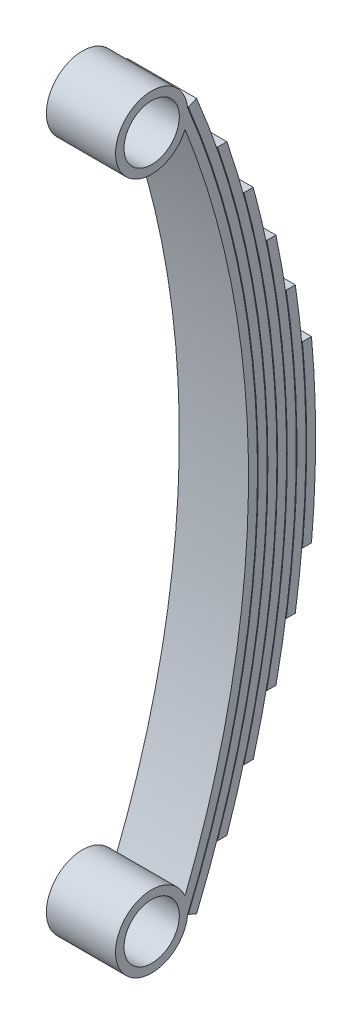
ISO-10303-21;
HEADER;
FILE_DESCRIPTION(('STEP AP214'),'2;1');
FILE_NAME('part.step','',(''),(''),'','','');
FILE_SCHEMA(('AUTOMOTIVE_DESIGN { 1 0 10303 214 1 1 1 1 }'));
ENDSEC;
DATA;
#1=APPLICATION_CONTEXT('core data for automotive mechanical design processes');
#2=APPLICATION_PROTOCOL_DEFINITION('international standard','automotive_design',2000,#1);
#3=PRODUCT_CONTEXT('',#1,'mechanical');
#4=PRODUCT('Part','Part','',(#3));
#5=PRODUCT_RELATED_PRODUCT_CATEGORY('part','',(#4));
#6=PRODUCT_DEFINITION_FORMATION('','',#4);
#7=PRODUCT_DEFINITION_CONTEXT('part definition',#1,'design');
#8=PRODUCT_DEFINITION('design','',#6,#7);
#9=PRODUCT_DEFINITION_SHAPE('','',#8);
#10=(LENGTH_UNIT() NAMED_UNIT(*) SI_UNIT(.MILLI.,.METRE.));
#11=(NAMED_UNIT(*) PLANE_ANGLE_UNIT() SI_UNIT($,.RADIAN.));
#12=(NAMED_UNIT(*) SI_UNIT($,.STERADIAN.) SOLID_ANGLE_UNIT());
#13=UNCERTAINTY_MEASURE_WITH_UNIT(LENGTH_MEASURE(1.E-05),#10,'distance_accuracy_value','');
#14=(GEOMETRIC_REPRESENTATION_CONTEXT(3) GLOBAL_UNCERTAINTY_ASSIGNED_CONTEXT((#13)) GLOBAL_UNIT_ASSIGNED_CONTEXT((#10,
#11,#12)) REPRESENTATION_CONTEXT('',''));
#15=CARTESIAN_POINT('',(0.,0.,0.));
#16=DIRECTION('',(0.,0.,1.));
#17=DIRECTION('',(1.,0.,0.));
#18=AXIS2_PLACEMENT_3D('',#15,#16,#17);
#19=CARTESIAN_POINT('',(-50.,0.,1300.));
#20=DIRECTION('',(1.,0.,0.));
#21=DIRECTION('',(0.,0.,-1.));
#22=AXIS2_PLACEMENT_3D('',#19,#20,#21);
#23=CYLINDRICAL_SURFACE('',#22,1397.);
#24=CARTESIAN_POINT('',(50.,0.,1300.));
#25=DIRECTION('',(1.,0.,0.));
#26=DIRECTION('',(0.,0.,-1.));
#27=AXIS2_PLACEMENT_3D('',#24,#25,#26);
#28=CIRCLE('',#27,1397.);
#29=CARTESIAN_POINT('',(50.,-129.211867254757,-91.0116079172521));
#30=VERTEX_POINT('',#29);
#31=CARTESIAN_POINT('',(50.,129.211867254757,-91.0116079172521));
#32=VERTEX_POINT('',#31);
#33=EDGE_CURVE('E120',#30,#32,#28,.T.);
#34=ORIENTED_EDGE('',*,*,#33,.F.);
#35=DIRECTION('',(1.,0.,0.));
#36=VECTOR('',#35,1.);
#37=CARTESIAN_POINT('',(-50.,-129.211867254757,-91.0116079172521));
#38=LINE('',#37,#36);
#39=CARTESIAN_POINT('',(-50.,-129.211867254757,-91.0116079172521));
#40=VERTEX_POINT('',#39);
#41=EDGE_CURVE('E12',#40,#30,#38,.T.);
#42=ORIENTED_EDGE('',*,*,#41,.F.);
#43=CARTESIAN_POINT('',(-50.,0.,1300.));
#44=DIRECTION('',(1.,0.,0.));
#45=DIRECTION('',(0.,0.,-1.));
#46=AXIS2_PLACEMENT_3D('',#43,#44,#45);
#47=CIRCLE('',#46,1397.);
#48=CARTESIAN_POINT('',(-50.,129.211867254757,-91.0116079172521));
#49=VERTEX_POINT('',#48);
#50=EDGE_CURVE('E114',#40,#49,#47,.T.);
#51=ORIENTED_EDGE('',*,*,#50,.T.);
#52=DIRECTION('',(1.,0.,0.));
#53=VECTOR('',#52,1.);
#54=CARTESIAN_POINT('',(-50.,129.211867254757,-91.0116079172521));
#55=LINE('',#54,#53);
#56=EDGE_CURVE('E59',#49,#32,#55,.T.);
#57=ORIENTED_EDGE('',*,*,#56,.T.);
#58=EDGE_LOOP('',(#34,#42,#51,#57));
#59=FACE_BOUND('',#58,.T.);
#60=ADVANCED_FACE('F56',(#59),#23,.T.);
#61=CARTESIAN_POINT('',(-50.,-129.211867254757,-77.9551129701355));
#62=DIRECTION('',(0.,-1.,0.));
#63=DIRECTION('',(0.,0.,-1.));
#64=AXIS2_PLACEMENT_3D('',#61,#62,#63);
#65=PLANE('',#64);
#66=DIRECTION('',(0.,0.,-1.));
#67=VECTOR('',#66,1.);
#68=CARTESIAN_POINT('',(50.,-129.211867254757,-77.9551129701355));
#69=LINE('',#68,#67);
#70=CARTESIAN_POINT('',(50.,-129.211867254757,-77.9551129701355));
#71=VERTEX_POINT('',#70);
#72=EDGE_CURVE('E116',#71,#30,#69,.T.);
#73=ORIENTED_EDGE('',*,*,#72,.F.);
#74=DIRECTION('',(1.,0.,0.));
#75=VECTOR('',#74,1.);
#76=CARTESIAN_POINT('',(-50.,-129.211867254757,-77.9551129701355));
#77=LINE('',#76,#75);
#78=CARTESIAN_POINT('',(-50.,-129.211867254757,-77.9551129701355));
#79=VERTEX_POINT('',#78);
#80=EDGE_CURVE('E65',#79,#71,#77,.T.);
#81=ORIENTED_EDGE('',*,*,#80,.F.);
#82=DIRECTION('',(0.,0.,-1.));
#83=VECTOR('',#82,1.);
#84=CARTESIAN_POINT('',(-50.,-129.211867254757,-77.9551129701355));
#85=LINE('',#84,#83);
#86=EDGE_CURVE('E111',#79,#40,#85,.T.);
#87=ORIENTED_EDGE('',*,*,#86,.T.);
#88=ORIENTED_EDGE('',*,*,#41,.T.);
#89=EDGE_LOOP('',(#73,#81,#87,#88));
#90=FACE_BOUND('',#89,.T.);
#91=ADVANCED_FACE('F130',(#90),#65,.T.);
#92=CARTESIAN_POINT('',(-50.,0.,1300.));
#93=DIRECTION('',(1.,0.,0.));
#94=DIRECTION('',(0.,0.,-1.));
#95=AXIS2_PLACEMENT_3D('',#92,#93,#94);
#96=CYLINDRICAL_SURFACE('',#95,1384.);
#97=CARTESIAN_POINT('',(50.,0.,1300.));
#98=DIRECTION('',(-1.,0.,0.));
#99=DIRECTION('',(0.,0.,-1.));
#100=AXIS2_PLACEMENT_3D('',#97,#98,#99);
#101=CIRCLE('',#100,1384.);
#102=CARTESIAN_POINT('',(50.,129.211867254757,-77.9551129701355));
#103=VERTEX_POINT('',#102);
#104=EDGE_CURVE('E106',#103,#71,#101,.T.);
#105=ORIENTED_EDGE('',*,*,#104,.F.);
#106=DIRECTION('',(1.,0.,0.));
#107=VECTOR('',#106,1.);
#108=CARTESIAN_POINT('',(-50.,129.211867254757,-77.9551129701355));
#109=LINE('',#108,#107);
#110=CARTESIAN_POINT('',(-50.,129.211867254757,-77.9551129701355));
#111=VERTEX_POINT('',#110);
#112=EDGE_CURVE('E101',#111,#103,#109,.T.);
#113=ORIENTED_EDGE('',*,*,#112,.F.);
#114=CARTESIAN_POINT('',(-50.,0.,1300.));
#115=DIRECTION('',(-1.,0.,0.));
#116=DIRECTION('',(0.,0.,-1.));
#117=AXIS2_PLACEMENT_3D('',#114,#115,#116);
#118=CIRCLE('',#117,1384.);
#119=EDGE_CURVE('E104',#111,#79,#118,.T.);
#120=ORIENTED_EDGE('',*,*,#119,.T.);
#121=ORIENTED_EDGE('',*,*,#80,.T.);
#122=EDGE_LOOP('',(#105,#113,#120,#121));
#123=FACE_BOUND('',#122,.T.);
#124=ADVANCED_FACE('F103',(#123),#96,.F.);
#125=CARTESIAN_POINT('',(-50.,129.211867254757,-77.9551129701355));
#126=DIRECTION('',(0.,1.,0.));
#127=DIRECTION('',(0.,0.,1.));
#128=AXIS2_PLACEMENT_3D('',#125,#126,#127);
#129=PLANE('',#128);
#130=DIRECTION('',(0.,0.,1.));
#131=VECTOR('',#130,1.);
#132=CARTESIAN_POINT('',(50.,129.211867254757,-77.9551129701355));
#133=LINE('',#132,#131);
#134=EDGE_CURVE('E123',#32,#103,#133,.T.);
#135=ORIENTED_EDGE('',*,*,#134,.F.);
#136=ORIENTED_EDGE('',*,*,#56,.F.);
#137=DIRECTION('',(0.,0.,1.));
#138=VECTOR('',#137,1.);
#139=CARTESIAN_POINT('',(-50.,129.211867254757,-77.9551129701355));
#140=LINE('',#139,#138);
#141=EDGE_CURVE('E110',#49,#111,#140,.T.);
#142=ORIENTED_EDGE('',*,*,#141,.T.);
#143=ORIENTED_EDGE('',*,*,#112,.T.);
#144=EDGE_LOOP('',(#135,#136,#142,#143));
#145=FACE_BOUND('',#144,.T.);
#146=ADVANCED_FACE('F113',(#145),#129,.T.);
#147=CARTESIAN_POINT('',(-50.,0.,1300.));
#148=DIRECTION('',(1.,0.,0.));
#149=DIRECTION('',(0.,0.,-1.));
#150=AXIS2_PLACEMENT_3D('',#147,#148,#149);
#151=PLANE('',#150);
#152=ORIENTED_EDGE('',*,*,#50,.F.);
#153=ORIENTED_EDGE('',*,*,#86,.F.);
#154=ORIENTED_EDGE('',*,*,#119,.F.);
#155=ORIENTED_EDGE('',*,*,#141,.F.);
#156=EDGE_LOOP('',(#152,#153,#154,#155));
#157=FACE_BOUND('',#156,.T.);
#158=ADVANCED_FACE('F109',(#157),#151,.F.);
#159=CARTESIAN_POINT('',(50.,0.,1300.));
#160=DIRECTION('',(1.,0.,0.));
#161=DIRECTION('',(0.,0.,-1.));
#162=AXIS2_PLACEMENT_3D('',#159,#160,#161);
#163=PLANE('',#162);
#164=ORIENTED_EDGE('',*,*,#33,.T.);
#165=ORIENTED_EDGE('',*,*,#134,.T.);
#166=ORIENTED_EDGE('',*,*,#104,.T.);
#167=ORIENTED_EDGE('',*,*,#72,.T.);
#168=EDGE_LOOP('',(#164,#165,#166,#167));
#169=FACE_BOUND('',#168,.T.);
#170=ADVANCED_FACE('F129',(#169),#163,.T.);
#171=CLOSED_SHELL('',(#60,#91,#124,#146,#158,#170));
#172=MANIFOLD_SOLID_BREP('B2',#171);
#173=CARTESIAN_POINT('',(-50.,0.,1300.));
#174=DIRECTION('',(1.,0.,0.));
#175=DIRECTION('',(0.,0.,-1.));
#176=AXIS2_PLACEMENT_3D('',#173,#174,#175);
#177=CYLINDRICAL_SURFACE('',#176,1383.);
#178=CARTESIAN_POINT('',(50.,0.,1300.));
#179=DIRECTION('',(1.,0.,0.));
#180=DIRECTION('',(0.,0.,-1.));
#181=AXIS2_PLACEMENT_3D('',#178,#179,#180);
#182=CIRCLE('',#181,1383.);
#183=CARTESIAN_POINT('',(50.,-205.56323151252,-67.6376559052949));
#184=VERTEX_POINT('',#183);
#185=CARTESIAN_POINT('',(50.,205.563231512519,-67.6376559052952));
#186=VERTEX_POINT('',#185);
#187=EDGE_CURVE('E254',#184,#186,#182,.T.);
#188=ORIENTED_EDGE('',*,*,#187,.F.);
#189=DIRECTION('',(1.,0.,0.));
#190=VECTOR('',#189,1.);
#191=CARTESIAN_POINT('',(-50.,-205.56323151252,-67.6376559052949));
#192=LINE('',#191,#190);
#193=CARTESIAN_POINT('',(-50.,-205.56323151252,-67.6376559052949));
#194=VERTEX_POINT('',#193);
#195=EDGE_CURVE('E54',#194,#184,#192,.T.);
#196=ORIENTED_EDGE('',*,*,#195,.F.);
#197=CARTESIAN_POINT('',(-50.,0.,1300.));
#198=DIRECTION('',(1.,0.,0.));
#199=DIRECTION('',(0.,0.,-1.));
#200=AXIS2_PLACEMENT_3D('',#197,#198,#199);
#201=CIRCLE('',#200,1383.);
#202=CARTESIAN_POINT('',(-50.,205.563231512519,-67.6376559052952));
#203=VERTEX_POINT('',#202);
#204=EDGE_CURVE('E248',#194,#203,#201,.T.);
#205=ORIENTED_EDGE('',*,*,#204,.T.);
#206=DIRECTION('',(1.,0.,0.));
#207=VECTOR('',#206,1.);
#208=CARTESIAN_POINT('',(-50.,205.563231512519,-67.6376559052952));
#209=LINE('',#208,#207);
#210=EDGE_CURVE('E193',#203,#186,#209,.T.);
#211=ORIENTED_EDGE('',*,*,#210,.T.);
#212=EDGE_LOOP('',(#188,#196,#205,#211));
#213=FACE_BOUND('',#212,.T.);
#214=ADVANCED_FACE('F190',(#213),#177,.T.);
#215=CARTESIAN_POINT('',(-50.,-205.56323151252,-54.4902206550366));
#216=DIRECTION('',(0.,-1.,0.));
#217=DIRECTION('',(0.,0.,-1.));
#218=AXIS2_PLACEMENT_3D('',#215,#216,#217);
#219=PLANE('',#218);
#220=DIRECTION('',(0.,0.,-1.));
#221=VECTOR('',#220,1.);
#222=CARTESIAN_POINT('',(50.,-205.56323151252,-54.4902206550366));
#223=LINE('',#222,#221);
#224=CARTESIAN_POINT('',(50.,-205.56323151252,-54.4902206550366));
#225=VERTEX_POINT('',#224);
#226=EDGE_CURVE('E250',#225,#184,#223,.T.);
#227=ORIENTED_EDGE('',*,*,#226,.F.);
#228=DIRECTION('',(1.,0.,0.));
#229=VECTOR('',#228,1.);
#230=CARTESIAN_POINT('',(-50.,-205.56323151252,-54.4902206550366));
#231=LINE('',#230,#229);
#232=CARTESIAN_POINT('',(-50.,-205.56323151252,-54.4902206550366));
#233=VERTEX_POINT('',#232);
#234=EDGE_CURVE('E199',#233,#225,#231,.T.);
#235=ORIENTED_EDGE('',*,*,#234,.F.);
#236=DIRECTION('',(0.,0.,-1.));
#237=VECTOR('',#236,1.);
#238=CARTESIAN_POINT('',(-50.,-205.56323151252,-54.4902206550366));
#239=LINE('',#238,#237);
#240=EDGE_CURVE('E245',#233,#194,#239,.T.);
#241=ORIENTED_EDGE('',*,*,#240,.T.);
#242=ORIENTED_EDGE('',*,*,#195,.T.);
#243=EDGE_LOOP('',(#227,#235,#241,#242));
#244=FACE_BOUND('',#243,.T.);
#245=ADVANCED_FACE('F264',(#244),#219,.T.);
#246=CARTESIAN_POINT('',(-50.,0.,1300.));
#247=DIRECTION('',(1.,0.,0.));
#248=DIRECTION('',(0.,0.,-1.));
#249=AXIS2_PLACEMENT_3D('',#246,#247,#248);
#250=CYLINDRICAL_SURFACE('',#249,1370.);
#251=CARTESIAN_POINT('',(50.,0.,1300.));
#252=DIRECTION('',(-1.,0.,0.));
#253=DIRECTION('',(0.,0.,-1.));
#254=AXIS2_PLACEMENT_3D('',#251,#252,#253);
#255=CIRCLE('',#254,1370.);
#256=CARTESIAN_POINT('',(50.,205.563231512519,-54.4902206550371));
#257=VERTEX_POINT('',#256);
#258=EDGE_CURVE('E240',#257,#225,#255,.T.);
#259=ORIENTED_EDGE('',*,*,#258,.F.);
#260=DIRECTION('',(1.,0.,0.));
#261=VECTOR('',#260,1.);
#262=CARTESIAN_POINT('',(-50.,205.563231512519,-54.4902206550371));
#263=LINE('',#262,#261);
#264=CARTESIAN_POINT('',(-50.,205.563231512519,-54.4902206550371));
#265=VERTEX_POINT('',#264);
#266=EDGE_CURVE('E235',#265,#257,#263,.T.);
#267=ORIENTED_EDGE('',*,*,#266,.F.);
#268=CARTESIAN_POINT('',(-50.,0.,1300.));
#269=DIRECTION('',(-1.,0.,0.));
#270=DIRECTION('',(0.,0.,-1.));
#271=AXIS2_PLACEMENT_3D('',#268,#269,#270);
#272=CIRCLE('',#271,1370.);
#273=EDGE_CURVE('E238',#265,#233,#272,.T.);
#274=ORIENTED_EDGE('',*,*,#273,.T.);
#275=ORIENTED_EDGE('',*,*,#234,.T.);
#276=EDGE_LOOP('',(#259,#267,#274,#275));
#277=FACE_BOUND('',#276,.T.);
#278=ADVANCED_FACE('F237',(#277),#250,.F.);
#279=CARTESIAN_POINT('',(-50.,205.563231512519,-54.4902206550369));
#280=DIRECTION('',(0.,1.,0.));
#281=DIRECTION('',(0.,0.,1.));
#282=AXIS2_PLACEMENT_3D('',#279,#280,#281);
#283=PLANE('',#282);
#284=DIRECTION('',(0.,0.,1.));
#285=VECTOR('',#284,1.);
#286=CARTESIAN_POINT('',(50.,205.563231512519,-54.4902206550369));
#287=LINE('',#286,#285);
#288=EDGE_CURVE('E257',#186,#257,#287,.T.);
#289=ORIENTED_EDGE('',*,*,#288,.F.);
#290=ORIENTED_EDGE('',*,*,#210,.F.);
#291=DIRECTION('',(0.,0.,1.));
#292=VECTOR('',#291,1.);
#293=CARTESIAN_POINT('',(-50.,205.563231512519,-54.4902206550369));
#294=LINE('',#293,#292);
#295=EDGE_CURVE('E244',#203,#265,#294,.T.);
#296=ORIENTED_EDGE('',*,*,#295,.T.);
#297=ORIENTED_EDGE('',*,*,#266,.T.);
#298=EDGE_LOOP('',(#289,#290,#296,#297));
#299=FACE_BOUND('',#298,.T.);
#300=ADVANCED_FACE('F247',(#299),#283,.T.);
#301=CARTESIAN_POINT('',(-50.,0.,1300.));
#302=DIRECTION('',(1.,0.,0.));
#303=DIRECTION('',(0.,0.,-1.));
#304=AXIS2_PLACEMENT_3D('',#301,#302,#303);
#305=PLANE('',#304);
#306=ORIENTED_EDGE('',*,*,#204,.F.);
#307=ORIENTED_EDGE('',*,*,#240,.F.);
#308=ORIENTED_EDGE('',*,*,#273,.F.);
#309=ORIENTED_EDGE('',*,*,#295,.F.);
#310=EDGE_LOOP('',(#306,#307,#308,#309));
#311=FACE_BOUND('',#310,.T.);
#312=ADVANCED_FACE('F243',(#311),#305,.F.);
#313=CARTESIAN_POINT('',(50.,0.,1300.));
#314=DIRECTION('',(1.,0.,0.));
#315=DIRECTION('',(0.,0.,-1.));
#316=AXIS2_PLACEMENT_3D('',#313,#314,#315);
#317=PLANE('',#316);
#318=ORIENTED_EDGE('',*,*,#187,.T.);
#319=ORIENTED_EDGE('',*,*,#288,.T.);
#320=ORIENTED_EDGE('',*,*,#258,.T.);
#321=ORIENTED_EDGE('',*,*,#226,.T.);
#322=EDGE_LOOP('',(#318,#319,#320,#321));
#323=FACE_BOUND('',#322,.T.);
#324=ADVANCED_FACE('F263',(#323),#317,.T.);
#325=CLOSED_SHELL('',(#214,#245,#278,#300,#312,#324));
#326=MANIFOLD_SOLID_BREP('B6',#325);
#327=CARTESIAN_POINT('',(-50.,0.,1300.));
#328=DIRECTION('',(1.,0.,0.));
#329=DIRECTION('',(0.,0.,-1.));
#330=AXIS2_PLACEMENT_3D('',#327,#328,#329);
#331=CYLINDRICAL_SURFACE('',#330,1369.);
#332=CARTESIAN_POINT('',(50.,0.,1300.));
#333=DIRECTION('',(1.,0.,0.));
#334=DIRECTION('',(0.,0.,-1.));
#335=AXIS2_PLACEMENT_3D('',#332,#333,#334);
#336=CIRCLE('',#335,1369.);
#337=CARTESIAN_POINT('',(50.,-281.857345942072,-39.6706447998667));
#338=VERTEX_POINT('',#337);
#339=CARTESIAN_POINT('',(50.,281.857345942072,-39.6706447998667));
#340=VERTEX_POINT('',#339);
#341=EDGE_CURVE('E388',#338,#340,#336,.T.);
#342=ORIENTED_EDGE('',*,*,#341,.F.);
#343=DIRECTION('',(1.,0.,0.));
#344=VECTOR('',#343,1.);
#345=CARTESIAN_POINT('',(-50.,-281.857345942072,-39.6706447998667));
#346=LINE('',#345,#344);
#347=CARTESIAN_POINT('',(-50.,-281.857345942072,-39.6706447998667));
#348=VERTEX_POINT('',#347);
#349=EDGE_CURVE('E188',#348,#338,#346,.T.);
#350=ORIENTED_EDGE('',*,*,#349,.F.);
#351=CARTESIAN_POINT('',(-50.,0.,1300.));
#352=DIRECTION('',(1.,0.,0.));
#353=DIRECTION('',(0.,0.,-1.));
#354=AXIS2_PLACEMENT_3D('',#351,#352,#353);
#355=CIRCLE('',#354,1369.);
#356=CARTESIAN_POINT('',(-50.,281.857345942072,-39.6706447998667));
#357=VERTEX_POINT('',#356);
#358=EDGE_CURVE('E382',#348,#357,#355,.T.);
#359=ORIENTED_EDGE('',*,*,#358,.T.);
#360=DIRECTION('',(1.,0.,0.));
#361=VECTOR('',#360,1.);
#362=CARTESIAN_POINT('',(-50.,281.857345942072,-39.6706447998667));
#363=LINE('',#362,#361);
#364=EDGE_CURVE('E327',#357,#340,#363,.T.);
#365=ORIENTED_EDGE('',*,*,#364,.T.);
#366=EDGE_LOOP('',(#342,#350,#359,#365));
#367=FACE_BOUND('',#366,.T.);
#368=ADVANCED_FACE('F324',(#367),#331,.T.);
#369=CARTESIAN_POINT('',(-50.,-281.857345942072,-39.6706447998667));
#370=DIRECTION('',(0.,-1.,0.));
#371=DIRECTION('',(0.,0.,-1.));
#372=AXIS2_PLACEMENT_3D('',#369,#370,#371);
#373=PLANE('',#372);
#374=DIRECTION('',(0.,0.,-1.));
#375=VECTOR('',#374,1.);
#376=CARTESIAN_POINT('',(50.,-281.857345942072,-39.6706447998667));
#377=LINE('',#376,#375);
#378=CARTESIAN_POINT('',(50.,-281.857345942072,-26.3832163211695));
#379=VERTEX_POINT('',#378);
#380=EDGE_CURVE('E384',#379,#338,#377,.T.);
#381=ORIENTED_EDGE('',*,*,#380,.F.);
#382=DIRECTION('',(1.,0.,0.));
#383=VECTOR('',#382,1.);
#384=CARTESIAN_POINT('',(-50.,-281.857345942072,-26.3832163211695));
#385=LINE('',#384,#383);
#386=CARTESIAN_POINT('',(-50.,-281.857345942072,-26.3832163211695));
#387=VERTEX_POINT('',#386);
#388=EDGE_CURVE('E333',#387,#379,#385,.T.);
#389=ORIENTED_EDGE('',*,*,#388,.F.);
#390=DIRECTION('',(0.,0.,-1.));
#391=VECTOR('',#390,1.);
#392=CARTESIAN_POINT('',(-50.,-281.857345942072,-39.6706447998667));
#393=LINE('',#392,#391);
#394=EDGE_CURVE('E379',#387,#348,#393,.T.);
#395=ORIENTED_EDGE('',*,*,#394,.T.);
#396=ORIENTED_EDGE('',*,*,#349,.T.);
#397=EDGE_LOOP('',(#381,#389,#395,#396));
#398=FACE_BOUND('',#397,.T.);
#399=ADVANCED_FACE('F398',(#398),#373,.T.);
#400=CARTESIAN_POINT('',(-50.,0.,1300.));
#401=DIRECTION('',(1.,0.,0.));
#402=DIRECTION('',(0.,0.,-1.));
#403=AXIS2_PLACEMENT_3D('',#400,#401,#402);
#404=CYLINDRICAL_SURFACE('',#403,1356.);
#405=CARTESIAN_POINT('',(50.,0.,1300.));
#406=DIRECTION('',(-1.,0.,0.));
#407=DIRECTION('',(0.,0.,-1.));
#408=AXIS2_PLACEMENT_3D('',#405,#406,#407);
#409=CIRCLE('',#408,1356.);
#410=CARTESIAN_POINT('',(50.,281.857345942072,-26.3832163211695));
#411=VERTEX_POINT('',#410);
#412=EDGE_CURVE('E374',#411,#379,#409,.T.);
#413=ORIENTED_EDGE('',*,*,#412,.F.);
#414=DIRECTION('',(1.,0.,0.));
#415=VECTOR('',#414,1.);
#416=CARTESIAN_POINT('',(-50.,281.857345942072,-26.3832163211695));
#417=LINE('',#416,#415);
#418=CARTESIAN_POINT('',(-50.,281.857345942072,-26.3832163211695));
#419=VERTEX_POINT('',#418);
#420=EDGE_CURVE('E369',#419,#411,#417,.T.);
#421=ORIENTED_EDGE('',*,*,#420,.F.);
#422=CARTESIAN_POINT('',(-50.,0.,1300.));
#423=DIRECTION('',(-1.,0.,0.));
#424=DIRECTION('',(0.,0.,-1.));
#425=AXIS2_PLACEMENT_3D('',#422,#423,#424);
#426=CIRCLE('',#425,1356.);
#427=EDGE_CURVE('E372',#419,#387,#426,.T.);
#428=ORIENTED_EDGE('',*,*,#427,.T.);
#429=ORIENTED_EDGE('',*,*,#388,.T.);
#430=EDGE_LOOP('',(#413,#421,#428,#429));
#431=FACE_BOUND('',#430,.T.);
#432=ADVANCED_FACE('F371',(#431),#404,.F.);
#433=CARTESIAN_POINT('',(-50.,281.857345942072,-39.6706447998667));
#434=DIRECTION('',(0.,1.,0.));
#435=DIRECTION('',(0.,0.,1.));
#436=AXIS2_PLACEMENT_3D('',#433,#434,#435);
#437=PLANE('',#436);
#438=DIRECTION('',(0.,0.,1.));
#439=VECTOR('',#438,1.);
#440=CARTESIAN_POINT('',(50.,281.857345942072,-39.6706447998667));
#441=LINE('',#440,#439);
#442=EDGE_CURVE('E391',#340,#411,#441,.T.);
#443=ORIENTED_EDGE('',*,*,#442,.F.);
#444=ORIENTED_EDGE('',*,*,#364,.F.);
#445=DIRECTION('',(0.,0.,1.));
#446=VECTOR('',#445,1.);
#447=CARTESIAN_POINT('',(-50.,281.857345942072,-39.6706447998667));
#448=LINE('',#447,#446);
#449=EDGE_CURVE('E378',#357,#419,#448,.T.);
#450=ORIENTED_EDGE('',*,*,#449,.T.);
#451=ORIENTED_EDGE('',*,*,#420,.T.);
#452=EDGE_LOOP('',(#443,#444,#450,#451));
#453=FACE_BOUND('',#452,.T.);
#454=ADVANCED_FACE('F381',(#453),#437,.T.);
#455=CARTESIAN_POINT('',(-50.,0.,1300.));
#456=DIRECTION('',(1.,0.,0.));
#457=DIRECTION('',(0.,0.,-1.));
#458=AXIS2_PLACEMENT_3D('',#455,#456,#457);
#459=PLANE('',#458);
#460=ORIENTED_EDGE('',*,*,#358,.F.);
#461=ORIENTED_EDGE('',*,*,#394,.F.);
#462=ORIENTED_EDGE('',*,*,#427,.F.);
#463=ORIENTED_EDGE('',*,*,#449,.F.);
#464=EDGE_LOOP('',(#460,#461,#462,#463));
#465=FACE_BOUND('',#464,.T.);
#466=ADVANCED_FACE('F377',(#465),#459,.F.);
#467=CARTESIAN_POINT('',(50.,0.,1300.));
#468=DIRECTION('',(1.,0.,0.));
#469=DIRECTION('',(0.,0.,-1.));
#470=AXIS2_PLACEMENT_3D('',#467,#468,#469);
#471=PLANE('',#470);
#472=ORIENTED_EDGE('',*,*,#341,.T.);
#473=ORIENTED_EDGE('',*,*,#442,.T.);
#474=ORIENTED_EDGE('',*,*,#412,.T.);
#475=ORIENTED_EDGE('',*,*,#380,.T.);
#476=EDGE_LOOP('',(#472,#473,#474,#475));
#477=FACE_BOUND('',#476,.T.);
#478=ADVANCED_FACE('F397',(#477),#471,.T.);
#479=CLOSED_SHELL('',(#368,#399,#432,#454,#466,#478));
#480=MANIFOLD_SOLID_BREP('B48',#479);
#481=CARTESIAN_POINT('',(-50.,0.,1300.));
#482=DIRECTION('',(1.,0.,0.));
#483=DIRECTION('',(0.,0.,-1.));
#484=AXIS2_PLACEMENT_3D('',#481,#482,#483);
#485=CYLINDRICAL_SURFACE('',#484,1355.);
#486=CARTESIAN_POINT('',(50.,0.,1300.));
#487=DIRECTION('',(1.,0.,0.));
#488=DIRECTION('',(0.,0.,-1.));
#489=AXIS2_PLACEMENT_3D('',#486,#487,#488);
#490=CIRCLE('',#489,1355.);
#491=CARTESIAN_POINT('',(50.,-358.093070613206,-6.82606064418745));
#492=VERTEX_POINT('',#491);
#493=CARTESIAN_POINT('',(50.,358.093070613206,-6.82606064418745));
#494=VERTEX_POINT('',#493);
#495=EDGE_CURVE('E522',#492,#494,#490,.T.);
#496=ORIENTED_EDGE('',*,*,#495,.F.);
#497=DIRECTION('',(1.,0.,0.));
#498=VECTOR('',#497,1.);
#499=CARTESIAN_POINT('',(-50.,-358.093070613206,-6.82606064418745));
#500=LINE('',#499,#498);
#501=CARTESIAN_POINT('',(-50.,-358.093070613206,-6.82606064418745));
#502=VERTEX_POINT('',#501);
#503=EDGE_CURVE('E322',#502,#492,#500,.T.);
#504=ORIENTED_EDGE('',*,*,#503,.F.);
#505=CARTESIAN_POINT('',(-50.,0.,1300.));
#506=DIRECTION('',(1.,0.,0.));
#507=DIRECTION('',(0.,0.,-1.));
#508=AXIS2_PLACEMENT_3D('',#505,#506,#507);
#509=CIRCLE('',#508,1355.);
#510=CARTESIAN_POINT('',(-50.,358.093070613206,-6.82606064418745));
#511=VERTEX_POINT('',#510);
#512=EDGE_CURVE('E516',#502,#511,#509,.T.);
#513=ORIENTED_EDGE('',*,*,#512,.T.);
#514=DIRECTION('',(1.,0.,0.));
#515=VECTOR('',#514,1.);
#516=CARTESIAN_POINT('',(-50.,358.093070613206,-6.82606064418745));
#517=LINE('',#516,#515);
#518=EDGE_CURVE('E461',#511,#494,#517,.T.);
#519=ORIENTED_EDGE('',*,*,#518,.T.);
#520=EDGE_LOOP('',(#496,#504,#513,#519));
#521=FACE_BOUND('',#520,.T.);
#522=ADVANCED_FACE('F458',(#521),#485,.T.);
#523=CARTESIAN_POINT('',(-50.,-358.093070613206,-6.82606064418745));
#524=DIRECTION('',(0.,-1.,0.));
#525=DIRECTION('',(0.,0.,-1.));
#526=AXIS2_PLACEMENT_3D('',#523,#524,#525);
#527=PLANE('',#526);
#528=DIRECTION('',(0.,0.,-1.));
#529=VECTOR('',#528,1.);
#530=CARTESIAN_POINT('',(50.,-358.093070613206,-6.82606064418745));
#531=LINE('',#530,#529);
#532=CARTESIAN_POINT('',(50.,-358.093070613206,6.65806811237823));
#533=VERTEX_POINT('',#532);
#534=EDGE_CURVE('E518',#533,#492,#531,.T.);
#535=ORIENTED_EDGE('',*,*,#534,.F.);
#536=DIRECTION('',(1.,0.,0.));
#537=VECTOR('',#536,1.);
#538=CARTESIAN_POINT('',(-50.,-358.093070613206,6.65806811237823));
#539=LINE('',#538,#537);
#540=CARTESIAN_POINT('',(-50.,-358.093070613206,6.65806811237823));
#541=VERTEX_POINT('',#540);
#542=EDGE_CURVE('E467',#541,#533,#539,.T.);
#543=ORIENTED_EDGE('',*,*,#542,.F.);
#544=DIRECTION('',(0.,0.,-1.));
#545=VECTOR('',#544,1.);
#546=CARTESIAN_POINT('',(-50.,-358.093070613206,-6.82606064418745));
#547=LINE('',#546,#545);
#548=EDGE_CURVE('E513',#541,#502,#547,.T.);
#549=ORIENTED_EDGE('',*,*,#548,.T.);
#550=ORIENTED_EDGE('',*,*,#503,.T.);
#551=EDGE_LOOP('',(#535,#543,#549,#550));
#552=FACE_BOUND('',#551,.T.);
#553=ADVANCED_FACE('F532',(#552),#527,.T.);
#554=CARTESIAN_POINT('',(-50.,0.,1300.));
#555=DIRECTION('',(1.,0.,0.));
#556=DIRECTION('',(0.,0.,-1.));
#557=AXIS2_PLACEMENT_3D('',#554,#555,#556);
#558=CYLINDRICAL_SURFACE('',#557,1342.);
#559=CARTESIAN_POINT('',(50.,0.,1300.));
#560=DIRECTION('',(-1.,0.,0.));
#561=DIRECTION('',(0.,0.,-1.));
#562=AXIS2_PLACEMENT_3D('',#559,#560,#561);
#563=CIRCLE('',#562,1342.);
#564=CARTESIAN_POINT('',(50.,358.093070613206,6.65806811237846));
#565=VERTEX_POINT('',#564);
#566=EDGE_CURVE('E508',#565,#533,#563,.T.);
#567=ORIENTED_EDGE('',*,*,#566,.F.);
#568=DIRECTION('',(1.,0.,0.));
#569=VECTOR('',#568,1.);
#570=CARTESIAN_POINT('',(-50.,358.093070613206,6.65806811237846));
#571=LINE('',#570,#569);
#572=CARTESIAN_POINT('',(-50.,358.093070613206,6.65806811237846));
#573=VERTEX_POINT('',#572);
#574=EDGE_CURVE('E503',#573,#565,#571,.T.);
#575=ORIENTED_EDGE('',*,*,#574,.F.);
#576=CARTESIAN_POINT('',(-50.,0.,1300.));
#577=DIRECTION('',(-1.,0.,0.));
#578=DIRECTION('',(0.,0.,-1.));
#579=AXIS2_PLACEMENT_3D('',#576,#577,#578);
#580=CIRCLE('',#579,1342.);
#581=EDGE_CURVE('E506',#573,#541,#580,.T.);
#582=ORIENTED_EDGE('',*,*,#581,.T.);
#583=ORIENTED_EDGE('',*,*,#542,.T.);
#584=EDGE_LOOP('',(#567,#575,#582,#583));
#585=FACE_BOUND('',#584,.T.);
#586=ADVANCED_FACE('F505',(#585),#558,.F.);
#587=CARTESIAN_POINT('',(-50.,358.093070613206,-6.82606064418745));
#588=DIRECTION('',(0.,1.,0.));
#589=DIRECTION('',(0.,0.,1.));
#590=AXIS2_PLACEMENT_3D('',#587,#588,#589);
#591=PLANE('',#590);
#592=DIRECTION('',(0.,0.,1.));
#593=VECTOR('',#592,1.);
#594=CARTESIAN_POINT('',(50.,358.093070613206,-6.82606064418745));
#595=LINE('',#594,#593);
#596=EDGE_CURVE('E525',#494,#565,#595,.T.);
#597=ORIENTED_EDGE('',*,*,#596,.F.);
#598=ORIENTED_EDGE('',*,*,#518,.F.);
#599=DIRECTION('',(0.,0.,1.));
#600=VECTOR('',#599,1.);
#601=CARTESIAN_POINT('',(-50.,358.093070613206,-6.82606064418745));
#602=LINE('',#601,#600);
#603=EDGE_CURVE('E512',#511,#573,#602,.T.);
#604=ORIENTED_EDGE('',*,*,#603,.T.);
#605=ORIENTED_EDGE('',*,*,#574,.T.);
#606=EDGE_LOOP('',(#597,#598,#604,#605));
#607=FACE_BOUND('',#606,.T.);
#608=ADVANCED_FACE('F515',(#607),#591,.T.);
#609=CARTESIAN_POINT('',(-50.,0.,1300.));
#610=DIRECTION('',(1.,0.,0.));
#611=DIRECTION('',(0.,0.,-1.));
#612=AXIS2_PLACEMENT_3D('',#609,#610,#611);
#613=PLANE('',#612);
#614=ORIENTED_EDGE('',*,*,#512,.F.);
#615=ORIENTED_EDGE('',*,*,#548,.F.);
#616=ORIENTED_EDGE('',*,*,#581,.F.);
#617=ORIENTED_EDGE('',*,*,#603,.F.);
#618=EDGE_LOOP('',(#614,#615,#616,#617));
#619=FACE_BOUND('',#618,.T.);
#620=ADVANCED_FACE('F511',(#619),#613,.F.);
#621=CARTESIAN_POINT('',(50.,0.,1300.));
#622=DIRECTION('',(1.,0.,0.));
#623=DIRECTION('',(0.,0.,-1.));
#624=AXIS2_PLACEMENT_3D('',#621,#622,#623);
#625=PLANE('',#624);
#626=ORIENTED_EDGE('',*,*,#495,.T.);
#627=ORIENTED_EDGE('',*,*,#596,.T.);
#628=ORIENTED_EDGE('',*,*,#566,.T.);
#629=ORIENTED_EDGE('',*,*,#534,.T.);
#630=EDGE_LOOP('',(#626,#627,#628,#629));
#631=FACE_BOUND('',#630,.T.);
#632=ADVANCED_FACE('F531',(#631),#625,.T.);
#633=CLOSED_SHELL('',(#522,#553,#586,#608,#620,#632));
#634=MANIFOLD_SOLID_BREP('B182',#633);
#635=CARTESIAN_POINT('',(-50.,0.,1300.));
#636=DIRECTION('',(1.,0.,0.));
#637=DIRECTION('',(0.,0.,-1.));
#638=AXIS2_PLACEMENT_3D('',#635,#636,#637);
#639=CYLINDRICAL_SURFACE('',#638,1341.);
#640=CARTESIAN_POINT('',(50.,0.,1300.));
#641=DIRECTION('',(1.,0.,0.));
#642=DIRECTION('',(0.,0.,-1.));
#643=AXIS2_PLACEMENT_3D('',#640,#641,#642);
#644=CIRCLE('',#643,1341.);
#645=CARTESIAN_POINT('',(50.,-434.269230769231,31.2639221622566));
#646=VERTEX_POINT('',#645);
#647=CARTESIAN_POINT('',(50.,434.269230769231,31.2639221622566));
#648=VERTEX_POINT('',#647);
#649=EDGE_CURVE('E656',#646,#648,#644,.T.);
#650=ORIENTED_EDGE('',*,*,#649,.F.);
#651=DIRECTION('',(1.,0.,0.));
#652=VECTOR('',#651,1.);
#653=CARTESIAN_POINT('',(-50.,-434.269230769231,31.2639221622566));
#654=LINE('',#653,#652);
#655=CARTESIAN_POINT('',(-50.,-434.269230769231,31.2639221622566));
#656=VERTEX_POINT('',#655);
#657=EDGE_CURVE('E456',#656,#646,#654,.T.);
#658=ORIENTED_EDGE('',*,*,#657,.F.);
#659=CARTESIAN_POINT('',(-50.,0.,1300.));
#660=DIRECTION('',(1.,0.,0.));
#661=DIRECTION('',(0.,0.,-1.));
#662=AXIS2_PLACEMENT_3D('',#659,#660,#661);
#663=CIRCLE('',#662,1341.);
#664=CARTESIAN_POINT('',(-50.,434.269230769231,31.2639221622566));
#665=VERTEX_POINT('',#664);
#666=EDGE_CURVE('E650',#656,#665,#663,.T.);
#667=ORIENTED_EDGE('',*,*,#666,.T.);
#668=DIRECTION('',(1.,0.,0.));
#669=VECTOR('',#668,1.);
#670=CARTESIAN_POINT('',(-50.,434.269230769231,31.2639221622566));
#671=LINE('',#670,#669);
#672=EDGE_CURVE('E595',#665,#648,#671,.T.);
#673=ORIENTED_EDGE('',*,*,#672,.T.);
#674=EDGE_LOOP('',(#650,#658,#667,#673));
#675=FACE_BOUND('',#674,.T.);
#676=ADVANCED_FACE('F592',(#675),#639,.T.);
#677=CARTESIAN_POINT('',(-50.,-434.269230769231,45.0122569494553));
#678=DIRECTION('',(0.,-1.,0.));
#679=DIRECTION('',(0.,0.,-1.));
#680=AXIS2_PLACEMENT_3D('',#677,#678,#679);
#681=PLANE('',#680);
#682=DIRECTION('',(0.,0.,-1.));
#683=VECTOR('',#682,1.);
#684=CARTESIAN_POINT('',(50.,-434.269230769231,45.0122569494553));
#685=LINE('',#684,#683);
#686=CARTESIAN_POINT('',(50.,-434.269230769231,45.0122569494553));
#687=VERTEX_POINT('',#686);
#688=EDGE_CURVE('E652',#687,#646,#685,.T.);
#689=ORIENTED_EDGE('',*,*,#688,.F.);
#690=DIRECTION('',(1.,0.,0.));
#691=VECTOR('',#690,1.);
#692=CARTESIAN_POINT('',(-50.,-434.269230769231,45.0122569494553));
#693=LINE('',#692,#691);
#694=CARTESIAN_POINT('',(-50.,-434.269230769231,45.0122569494553));
#695=VERTEX_POINT('',#694);
#696=EDGE_CURVE('E601',#695,#687,#693,.T.);
#697=ORIENTED_EDGE('',*,*,#696,.F.);
#698=DIRECTION('',(0.,0.,-1.));
#699=VECTOR('',#698,1.);
#700=CARTESIAN_POINT('',(-50.,-434.269230769231,45.0122569494553));
#701=LINE('',#700,#699);
#702=EDGE_CURVE('E647',#695,#656,#701,.T.);
#703=ORIENTED_EDGE('',*,*,#702,.T.);
#704=ORIENTED_EDGE('',*,*,#657,.T.);
#705=EDGE_LOOP('',(#689,#697,#703,#704));
#706=FACE_BOUND('',#705,.T.);
#707=ADVANCED_FACE('F666',(#706),#681,.T.);
#708=CARTESIAN_POINT('',(-50.,0.,1300.));
#709=DIRECTION('',(1.,0.,0.));
#710=DIRECTION('',(0.,0.,-1.));
#711=AXIS2_PLACEMENT_3D('',#708,#709,#710);
#712=CYLINDRICAL_SURFACE('',#711,1328.);
#713=CARTESIAN_POINT('',(50.,0.,1300.));
#714=DIRECTION('',(-1.,0.,0.));
#715=DIRECTION('',(0.,0.,-1.));
#716=AXIS2_PLACEMENT_3D('',#713,#714,#715);
#717=CIRCLE('',#716,1328.);
#718=CARTESIAN_POINT('',(50.,434.269230769232,45.0122569494555));
#719=VERTEX_POINT('',#718);
#720=EDGE_CURVE('E642',#719,#687,#717,.T.);
#721=ORIENTED_EDGE('',*,*,#720,.F.);
#722=DIRECTION('',(1.,0.,0.));
#723=VECTOR('',#722,1.);
#724=CARTESIAN_POINT('',(-50.,434.269230769232,45.0122569494555));
#725=LINE('',#724,#723);
#726=CARTESIAN_POINT('',(-50.,434.269230769232,45.0122569494555));
#727=VERTEX_POINT('',#726);
#728=EDGE_CURVE('E637',#727,#719,#725,.T.);
#729=ORIENTED_EDGE('',*,*,#728,.F.);
#730=CARTESIAN_POINT('',(-50.,0.,1300.));
#731=DIRECTION('',(-1.,0.,0.));
#732=DIRECTION('',(0.,0.,-1.));
#733=AXIS2_PLACEMENT_3D('',#730,#731,#732);
#734=CIRCLE('',#733,1328.);
#735=EDGE_CURVE('E640',#727,#695,#734,.T.);
#736=ORIENTED_EDGE('',*,*,#735,.T.);
#737=ORIENTED_EDGE('',*,*,#696,.T.);
#738=EDGE_LOOP('',(#721,#729,#736,#737));
#739=FACE_BOUND('',#738,.T.);
#740=ADVANCED_FACE('F639',(#739),#712,.F.);
#741=CARTESIAN_POINT('',(-50.,434.269230769231,45.0122569494553));
#742=DIRECTION('',(0.,1.,0.));
#743=DIRECTION('',(0.,0.,1.));
#744=AXIS2_PLACEMENT_3D('',#741,#742,#743);
#745=PLANE('',#744);
#746=DIRECTION('',(0.,0.,1.));
#747=VECTOR('',#746,1.);
#748=CARTESIAN_POINT('',(50.,434.269230769231,45.0122569494553));
#749=LINE('',#748,#747);
#750=EDGE_CURVE('E659',#648,#719,#749,.T.);
#751=ORIENTED_EDGE('',*,*,#750,.F.);
#752=ORIENTED_EDGE('',*,*,#672,.F.);
#753=DIRECTION('',(0.,0.,1.));
#754=VECTOR('',#753,1.);
#755=CARTESIAN_POINT('',(-50.,434.269230769231,45.0122569494553));
#756=LINE('',#755,#754);
#757=EDGE_CURVE('E646',#665,#727,#756,.T.);
#758=ORIENTED_EDGE('',*,*,#757,.T.);
#759=ORIENTED_EDGE('',*,*,#728,.T.);
#760=EDGE_LOOP('',(#751,#752,#758,#759));
#761=FACE_BOUND('',#760,.T.);
#762=ADVANCED_FACE('F649',(#761),#745,.T.);
#763=CARTESIAN_POINT('',(-50.,0.,1300.));
#764=DIRECTION('',(1.,0.,0.));
#765=DIRECTION('',(0.,0.,-1.));
#766=AXIS2_PLACEMENT_3D('',#763,#764,#765);
#767=PLANE('',#766);
#768=ORIENTED_EDGE('',*,*,#666,.F.);
#769=ORIENTED_EDGE('',*,*,#702,.F.);
#770=ORIENTED_EDGE('',*,*,#735,.F.);
#771=ORIENTED_EDGE('',*,*,#757,.F.);
#772=EDGE_LOOP('',(#768,#769,#770,#771));
#773=FACE_BOUND('',#772,.T.);
#774=ADVANCED_FACE('F645',(#773),#767,.F.);
#775=CARTESIAN_POINT('',(50.,0.,1300.));
#776=DIRECTION('',(1.,0.,0.));
#777=DIRECTION('',(0.,0.,-1.));
#778=AXIS2_PLACEMENT_3D('',#775,#776,#777);
#779=PLANE('',#778);
#780=ORIENTED_EDGE('',*,*,#649,.T.);
#781=ORIENTED_EDGE('',*,*,#750,.T.);
#782=ORIENTED_EDGE('',*,*,#720,.T.);
#783=ORIENTED_EDGE('',*,*,#688,.T.);
#784=EDGE_LOOP('',(#780,#781,#782,#783));
#785=FACE_BOUND('',#784,.T.);
#786=ADVANCED_FACE('F665',(#785),#779,.T.);
#787=CLOSED_SHELL('',(#676,#707,#740,#762,#774,#786));
#788=MANIFOLD_SOLID_BREP('B316',#787);
#789=CARTESIAN_POINT('',(-50.,0.,1300.));
#790=DIRECTION('',(1.,0.,0.));
#791=DIRECTION('',(0.,0.,-1.));
#792=AXIS2_PLACEMENT_3D('',#789,#790,#791);
#793=CYLINDRICAL_SURFACE('',#792,1327.);
#794=CARTESIAN_POINT('',(50.,0.,1300.));
#795=DIRECTION('',(1.,0.,0.));
#796=DIRECTION('',(0.,0.,-1.));
#797=AXIS2_PLACEMENT_3D('',#794,#795,#796);
#798=CIRCLE('',#797,1327.);
#799=CARTESIAN_POINT('',(50.,-510.384615384616,75.0769230769233));
#800=VERTEX_POINT('',#799);
#801=CARTESIAN_POINT('',(50.,510.384615384614,75.0769230769226));
#802=VERTEX_POINT('',#801);
#803=EDGE_CURVE('E789',#800,#802,#798,.T.);
#804=ORIENTED_EDGE('',*,*,#803,.F.);
#805=DIRECTION('',(1.,0.,0.));
#806=VECTOR('',#805,1.);
#807=CARTESIAN_POINT('',(-50.,-510.384615384616,75.0769230769233));
#808=LINE('',#807,#806);
#809=CARTESIAN_POINT('',(-50.,-510.384615384616,75.0769230769233));
#810=VERTEX_POINT('',#809);
#811=EDGE_CURVE('E590',#810,#800,#808,.T.);
#812=ORIENTED_EDGE('',*,*,#811,.F.);
#813=CARTESIAN_POINT('',(-50.,0.,1300.));
#814=DIRECTION('',(1.,0.,0.));
#815=DIRECTION('',(0.,0.,-1.));
#816=AXIS2_PLACEMENT_3D('',#813,#814,#815);
#817=CIRCLE('',#816,1327.);
#818=CARTESIAN_POINT('',(-50.,510.384615384614,75.0769230769226));
#819=VERTEX_POINT('',#818);
#820=EDGE_CURVE('E783',#810,#819,#817,.T.);
#821=ORIENTED_EDGE('',*,*,#820,.T.);
#822=DIRECTION('',(1.,0.,0.));
#823=VECTOR('',#822,1.);
#824=CARTESIAN_POINT('',(-50.,510.384615384614,75.0769230769226));
#825=LINE('',#824,#823);
#826=EDGE_CURVE('E728',#819,#802,#825,.T.);
#827=ORIENTED_EDGE('',*,*,#826,.T.);
#828=EDGE_LOOP('',(#804,#812,#821,#827));
#829=FACE_BOUND('',#828,.T.);
#830=ADVANCED_FACE('F725',(#829),#793,.T.);
#831=CARTESIAN_POINT('',(-50.,-505.384615384616,87.0769230769233));
#832=DIRECTION('',(0.,-0.923076923076923,0.384615384615385));
#833=DIRECTION('',(0.,-0.384615384615385,-0.923076923076923));
#834=AXIS2_PLACEMENT_3D('',#831,#832,#833);
#835=PLANE('',#834);
#836=DIRECTION('',(0.,-0.384615384615385,-0.923076923076923));
#837=VECTOR('',#836,1.);
#838=CARTESIAN_POINT('',(50.,-505.384615384616,87.0769230769233));
#839=LINE('',#838,#837);
#840=CARTESIAN_POINT('',(50.,-505.384615384616,87.0769230769233));
#841=VERTEX_POINT('',#840);
#842=EDGE_CURVE('E785',#841,#800,#839,.T.);
#843=ORIENTED_EDGE('',*,*,#842,.F.);
#844=DIRECTION('',(1.,0.,0.));
#845=VECTOR('',#844,1.);
#846=CARTESIAN_POINT('',(-50.,-505.384615384616,87.0769230769233));
#847=LINE('',#846,#845);
#848=CARTESIAN_POINT('',(-50.,-505.384615384616,87.0769230769233));
#849=VERTEX_POINT('',#848);
#850=EDGE_CURVE('E734',#849,#841,#847,.T.);
#851=ORIENTED_EDGE('',*,*,#850,.F.);
#852=DIRECTION('',(0.,-0.384615384615385,-0.923076923076923));
#853=VECTOR('',#852,1.);
#854=CARTESIAN_POINT('',(-50.,-505.384615384616,87.0769230769233));
#855=LINE('',#854,#853);
#856=EDGE_CURVE('E780',#849,#810,#855,.T.);
#857=ORIENTED_EDGE('',*,*,#856,.T.);
#858=ORIENTED_EDGE('',*,*,#811,.T.);
#859=EDGE_LOOP('',(#843,#851,#857,#858));
#860=FACE_BOUND('',#859,.T.);
#861=ADVANCED_FACE('F799',(#860),#835,.T.);
#862=CARTESIAN_POINT('',(-50.,0.,1300.));
#863=DIRECTION('',(1.,0.,0.));
#864=DIRECTION('',(0.,0.,-1.));
#865=AXIS2_PLACEMENT_3D('',#862,#863,#864);
#866=CYLINDRICAL_SURFACE('',#865,1314.);
#867=CARTESIAN_POINT('',(50.,0.,1300.));
#868=DIRECTION('',(-1.,0.,0.));
#869=DIRECTION('',(0.,0.,-1.));
#870=AXIS2_PLACEMENT_3D('',#867,#868,#869);
#871=CIRCLE('',#870,1314.);
#872=CARTESIAN_POINT('',(50.,505.384615384615,87.0769230769226));
#873=VERTEX_POINT('',#872);
#874=EDGE_CURVE('E775',#873,#841,#871,.T.);
#875=ORIENTED_EDGE('',*,*,#874,.F.);
#876=DIRECTION('',(1.,0.,0.));
#877=VECTOR('',#876,1.);
#878=CARTESIAN_POINT('',(-50.,505.384615384615,87.0769230769226));
#879=LINE('',#878,#877);
#880=CARTESIAN_POINT('',(-50.,505.384615384615,87.0769230769226));
#881=VERTEX_POINT('',#880);
#882=EDGE_CURVE('E770',#881,#873,#879,.T.);
#883=ORIENTED_EDGE('',*,*,#882,.F.);
#884=CARTESIAN_POINT('',(-50.,0.,1300.));
#885=DIRECTION('',(-1.,0.,0.));
#886=DIRECTION('',(0.,0.,-1.));
#887=AXIS2_PLACEMENT_3D('',#884,#885,#886);
#888=CIRCLE('',#887,1314.);
#889=EDGE_CURVE('E773',#881,#849,#888,.T.);
#890=ORIENTED_EDGE('',*,*,#889,.T.);
#891=ORIENTED_EDGE('',*,*,#850,.T.);
#892=EDGE_LOOP('',(#875,#883,#890,#891));
#893=FACE_BOUND('',#892,.T.);
#894=ADVANCED_FACE('F772',(#893),#866,.F.);
#895=CARTESIAN_POINT('',(-50.,505.384615384614,87.0769230769226));
#896=DIRECTION('',(0.,0.923076923076923,0.384615384615385));
#897=DIRECTION('',(0.,-0.384615384615385,0.923076923076923));
#898=AXIS2_PLACEMENT_3D('',#895,#896,#897);
#899=PLANE('',#898);
#900=DIRECTION('',(0.,-0.384615384615385,0.923076923076923));
#901=VECTOR('',#900,1.);
#902=CARTESIAN_POINT('',(50.,505.384615384614,87.0769230769226));
#903=LINE('',#902,#901);
#904=EDGE_CURVE('E792',#802,#873,#903,.T.);
#905=ORIENTED_EDGE('',*,*,#904,.F.);
#906=ORIENTED_EDGE('',*,*,#826,.F.);
#907=DIRECTION('',(0.,-0.384615384615385,0.923076923076923));
#908=VECTOR('',#907,1.);
#909=CARTESIAN_POINT('',(-50.,505.384615384614,87.0769230769226));
#910=LINE('',#909,#908);
#911=EDGE_CURVE('E779',#819,#881,#910,.T.);
#912=ORIENTED_EDGE('',*,*,#911,.T.);
#913=ORIENTED_EDGE('',*,*,#882,.T.);
#914=EDGE_LOOP('',(#905,#906,#912,#913));
#915=FACE_BOUND('',#914,.T.);
#916=ADVANCED_FACE('F782',(#915),#899,.T.);
#917=CARTESIAN_POINT('',(-50.,0.,1300.));
#918=DIRECTION('',(1.,0.,0.));
#919=DIRECTION('',(0.,0.,-1.));
#920=AXIS2_PLACEMENT_3D('',#917,#918,#919);
#921=PLANE('',#920);
#922=ORIENTED_EDGE('',*,*,#820,.F.);
#923=ORIENTED_EDGE('',*,*,#856,.F.);
#924=ORIENTED_EDGE('',*,*,#889,.F.);
#925=ORIENTED_EDGE('',*,*,#911,.F.);
#926=EDGE_LOOP('',(#922,#923,#924,#925));
#927=FACE_BOUND('',#926,.T.);
#928=ADVANCED_FACE('F778',(#927),#921,.F.);
#929=CARTESIAN_POINT('',(50.,0.,1300.));
#930=DIRECTION('',(1.,0.,0.));
#931=DIRECTION('',(0.,0.,-1.));
#932=AXIS2_PLACEMENT_3D('',#929,#930,#931);
#933=PLANE('',#932);
#934=ORIENTED_EDGE('',*,*,#803,.T.);
#935=ORIENTED_EDGE('',*,*,#904,.T.);
#936=ORIENTED_EDGE('',*,*,#874,.T.);
#937=ORIENTED_EDGE('',*,*,#842,.T.);
#938=EDGE_LOOP('',(#934,#935,#936,#937));
#939=FACE_BOUND('',#938,.T.);
#940=ADVANCED_FACE('F798',(#939),#933,.T.);
#941=CLOSED_SHELL('',(#830,#861,#894,#916,#928,#940));
#942=MANIFOLD_SOLID_BREP('B450',#941);
#943=CARTESIAN_POINT('',(50.,-500.,140.));
#944=DIRECTION('',(-1.,0.,0.));
#945=DIRECTION('',(0.,0.,1.));
#946=AXIS2_PLACEMENT_3D('',#943,#944,#945);
#947=CYLINDRICAL_SURFACE('',#946,52.2398315464359);
#948=CARTESIAN_POINT('',(-50.,-500.,140.));
#949=DIRECTION('',(1.,0.,0.));
#950=DIRECTION('',(0.,0.,-1.));
#951=AXIS2_PLACEMENT_3D('',#948,#949,#950);
#952=CIRCLE('',#951,52.2398315464359);
#953=CARTESIAN_POINT('',(-50.,-479.851684164169,91.8020190362776));
#954=VERTEX_POINT('',#953);
#955=CARTESIAN_POINT('',(-50.,-505.000000000001,88.0000000000001));
#956=VERTEX_POINT('',#955);
#957=EDGE_CURVE('E919',#954,#956,#952,.T.);
#958=ORIENTED_EDGE('',*,*,#957,.T.);
#959=DIRECTION('',(-1.,0.,0.));
#960=VECTOR('',#959,1.);
#961=CARTESIAN_POINT('',(50.,-505.000000000001,88.0000000000001));
#962=LINE('',#961,#960);
#963=CARTESIAN_POINT('',(50.,-505.000000000001,88.0000000000001));
#964=VERTEX_POINT('',#963);
#965=EDGE_CURVE('E723',#964,#956,#962,.T.);
#966=ORIENTED_EDGE('',*,*,#965,.F.);
#967=CARTESIAN_POINT('',(50.,-500.,140.));
#968=DIRECTION('',(1.,0.,0.));
#969=DIRECTION('',(0.,0.,-1.));
#970=AXIS2_PLACEMENT_3D('',#967,#968,#969);
#971=CIRCLE('',#970,52.2398315464359);
#972=CARTESIAN_POINT('',(50.,-479.851684164169,91.8020190362776));
#973=VERTEX_POINT('',#972);
#974=EDGE_CURVE('E899',#973,#964,#971,.T.);
#975=ORIENTED_EDGE('',*,*,#974,.F.);
#976=DIRECTION('',(-1.,0.,0.));
#977=VECTOR('',#976,1.);
#978=CARTESIAN_POINT('',(50.,-479.851684164169,91.8020190362776));
#979=LINE('',#978,#977);
#980=EDGE_CURVE('E865',#973,#954,#979,.T.);
#981=ORIENTED_EDGE('',*,*,#980,.T.);
#982=EDGE_LOOP('',(#958,#966,#975,#981));
#983=FACE_BOUND('',#982,.T.);
#984=ADVANCED_FACE('F849',(#983),#947,.T.);
#985=CARTESIAN_POINT('',(50.,0.,1300.));
#986=DIRECTION('',(-1.,0.,0.));
#987=DIRECTION('',(0.,0.,1.));
#988=AXIS2_PLACEMENT_3D('',#985,#986,#987);
#989=CYLINDRICAL_SURFACE('',#988,1313.);
#990=CARTESIAN_POINT('',(-50.,0.,1300.));
#991=DIRECTION('',(1.,0.,0.));
#992=DIRECTION('',(0.,0.,-1.));
#993=AXIS2_PLACEMENT_3D('',#990,#991,#992);
#994=CIRCLE('',#993,1313.);
#995=CARTESIAN_POINT('',(-50.,504.999999999999,87.9999999999997));
#996=VERTEX_POINT('',#995);
#997=EDGE_CURVE('E904',#956,#996,#994,.T.);
#998=ORIENTED_EDGE('',*,*,#997,.T.);
#999=DIRECTION('',(-1.,0.,0.));
#1000=VECTOR('',#999,1.);
#1001=CARTESIAN_POINT('',(50.,504.999999999999,87.9999999999997));
#1002=LINE('',#1001,#1000);
#1003=CARTESIAN_POINT('',(50.,504.999999999999,87.9999999999997));
#1004=VERTEX_POINT('',#1003);
#1005=EDGE_CURVE('E857',#1004,#996,#1002,.T.);
#1006=ORIENTED_EDGE('',*,*,#1005,.F.);
#1007=CARTESIAN_POINT('',(50.,0.,1300.));
#1008=DIRECTION('',(1.,0.,0.));
#1009=DIRECTION('',(0.,0.,-1.));
#1010=AXIS2_PLACEMENT_3D('',#1007,#1008,#1009);
#1011=CIRCLE('',#1010,1313.);
#1012=EDGE_CURVE('E891',#964,#1004,#1011,.T.);
#1013=ORIENTED_EDGE('',*,*,#1012,.F.);
#1014=ORIENTED_EDGE('',*,*,#965,.T.);
#1015=EDGE_LOOP('',(#998,#1006,#1013,#1014));
#1016=FACE_BOUND('',#1015,.T.);
#1017=ADVANCED_FACE('F903',(#1016),#989,.T.);
#1018=CARTESIAN_POINT('',(50.,500.,140.));
#1019=DIRECTION('',(-1.,0.,0.));
#1020=DIRECTION('',(0.,0.,1.));
#1021=AXIS2_PLACEMENT_3D('',#1018,#1019,#1020);
#1022=CYLINDRICAL_SURFACE('',#1021,52.239831546436);
#1023=CARTESIAN_POINT('',(-50.,500.,140.));
#1024=DIRECTION('',(1.,0.,0.));
#1025=DIRECTION('',(0.,0.,-1.));
#1026=AXIS2_PLACEMENT_3D('',#1023,#1024,#1025);
#1027=CIRCLE('',#1026,52.239831546436);
#1028=CARTESIAN_POINT('',(-50.,479.851684164169,91.8020190362775));
#1029=VERTEX_POINT('',#1028);
#1030=EDGE_CURVE('E922',#996,#1029,#1027,.T.);
#1031=ORIENTED_EDGE('',*,*,#1030,.T.);
#1032=DIRECTION('',(-1.,0.,0.));
#1033=VECTOR('',#1032,1.);
#1034=CARTESIAN_POINT('',(50.,479.851684164169,91.8020190362775));
#1035=LINE('',#1034,#1033);
#1036=CARTESIAN_POINT('',(50.,479.851684164169,91.8020190362775));
#1037=VERTEX_POINT('',#1036);
#1038=EDGE_CURVE('E880',#1037,#1029,#1035,.T.);
#1039=ORIENTED_EDGE('',*,*,#1038,.F.);
#1040=CARTESIAN_POINT('',(50.,500.,140.));
#1041=DIRECTION('',(1.,0.,0.));
#1042=DIRECTION('',(0.,0.,-1.));
#1043=AXIS2_PLACEMENT_3D('',#1040,#1041,#1042);
#1044=CIRCLE('',#1043,52.239831546436);
#1045=EDGE_CURVE('E898',#1004,#1037,#1044,.T.);
#1046=ORIENTED_EDGE('',*,*,#1045,.F.);
#1047=ORIENTED_EDGE('',*,*,#1005,.T.);
#1048=EDGE_LOOP('',(#1031,#1039,#1046,#1047));
#1049=FACE_BOUND('',#1048,.T.);
#1050=ADVANCED_FACE('F907',(#1049),#1022,.T.);
#1051=CARTESIAN_POINT('',(50.,-500.,140.));
#1052=DIRECTION('',(-1.,0.,0.));
#1053=DIRECTION('',(0.,0.,1.));
#1054=AXIS2_PLACEMENT_3D('',#1051,#1052,#1053);
#1055=CYLINDRICAL_SURFACE('',#1054,40.);
#1056=CARTESIAN_POINT('',(50.,-500.,140.));
#1057=DIRECTION('',(1.,0.,0.));
#1058=DIRECTION('',(0.,0.,-1.));
#1059=AXIS2_PLACEMENT_3D('',#1056,#1057,#1058);
#1060=CIRCLE('',#1059,40.);
#1061=CARTESIAN_POINT('',(50.,-500.,99.9999999999999));
#1062=VERTEX_POINT('',#1061);
#1063=EDGE_CURVE('E910',#1062,#1062,#1060,.T.);
#1064=ORIENTED_EDGE('',*,*,#1063,.T.);
#1065=EDGE_LOOP('',(#1064));
#1066=FACE_BOUND('',#1065,.T.);
#1067=CARTESIAN_POINT('',(-50.,-500.,140.));
#1068=DIRECTION('',(1.,0.,0.));
#1069=DIRECTION('',(0.,0.,-1.));
#1070=AXIS2_PLACEMENT_3D('',#1067,#1068,#1069);
#1071=CIRCLE('',#1070,40.);
#1072=CARTESIAN_POINT('',(-50.,-500.,99.9999999999999));
#1073=VERTEX_POINT('',#1072);
#1074=EDGE_CURVE('E927',#1073,#1073,#1071,.T.);
#1075=ORIENTED_EDGE('',*,*,#1074,.F.);
#1076=EDGE_LOOP('',(#1075));
#1077=FACE_BOUND('',#1076,.T.);
#1078=ADVANCED_FACE('F948',(#1066,#1077),#1055,.F.);
#1079=CARTESIAN_POINT('',(50.,0.,1300.));
#1080=DIRECTION('',(-1.,0.,0.));
#1081=DIRECTION('',(0.,0.,1.));
#1082=AXIS2_PLACEMENT_3D('',#1079,#1080,#1081);
#1083=CYLINDRICAL_SURFACE('',#1082,1300.);
#1084=CARTESIAN_POINT('',(-50.,0.,1300.));
#1085=DIRECTION('',(1.,0.,0.));
#1086=DIRECTION('',(0.,0.,-1.));
#1087=AXIS2_PLACEMENT_3D('',#1084,#1085,#1086);
#1088=CIRCLE('',#1087,1300.);
#1089=EDGE_CURVE('E924',#954,#1029,#1088,.T.);
#1090=ORIENTED_EDGE('',*,*,#1089,.F.);
#1091=ORIENTED_EDGE('',*,*,#980,.F.);
#1092=CARTESIAN_POINT('',(50.,0.,1300.));
#1093=DIRECTION('',(1.,0.,0.));
#1094=DIRECTION('',(0.,0.,-1.));
#1095=AXIS2_PLACEMENT_3D('',#1092,#1093,#1094);
#1096=CIRCLE('',#1095,1300.);
#1097=EDGE_CURVE('E908',#973,#1037,#1096,.T.);
#1098=ORIENTED_EDGE('',*,*,#1097,.T.);
#1099=ORIENTED_EDGE('',*,*,#1038,.T.);
#1100=EDGE_LOOP('',(#1090,#1091,#1098,#1099));
#1101=FACE_BOUND('',#1100,.T.);
#1102=ADVANCED_FACE('F940',(#1101),#1083,.F.);
#1103=CARTESIAN_POINT('',(50.,500.,140.));
#1104=DIRECTION('',(-1.,0.,0.));
#1105=DIRECTION('',(0.,0.,1.));
#1106=AXIS2_PLACEMENT_3D('',#1103,#1104,#1105);
#1107=CYLINDRICAL_SURFACE('',#1106,40.);
#1108=CARTESIAN_POINT('',(50.,500.,140.));
#1109=DIRECTION('',(1.,0.,0.));
#1110=DIRECTION('',(0.,0.,-1.));
#1111=AXIS2_PLACEMENT_3D('',#1108,#1109,#1110);
#1112=CIRCLE('',#1111,40.);
#1113=CARTESIAN_POINT('',(50.,500.,99.9999999999998));
#1114=VERTEX_POINT('',#1113);
#1115=EDGE_CURVE('E916',#1114,#1114,#1112,.T.);
#1116=ORIENTED_EDGE('',*,*,#1115,.T.);
#1117=EDGE_LOOP('',(#1116));
#1118=FACE_BOUND('',#1117,.T.);
#1119=CARTESIAN_POINT('',(-50.,500.,140.));
#1120=DIRECTION('',(1.,0.,0.));
#1121=DIRECTION('',(0.,0.,-1.));
#1122=AXIS2_PLACEMENT_3D('',#1119,#1120,#1121);
#1123=CIRCLE('',#1122,40.);
#1124=CARTESIAN_POINT('',(-50.,500.,99.9999999999998));
#1125=VERTEX_POINT('',#1124);
#1126=EDGE_CURVE('E930',#1125,#1125,#1123,.T.);
#1127=ORIENTED_EDGE('',*,*,#1126,.F.);
#1128=EDGE_LOOP('',(#1127));
#1129=FACE_BOUND('',#1128,.T.);
#1130=ADVANCED_FACE('F938',(#1118,#1129),#1107,.F.);
#1131=CARTESIAN_POINT('',(50.,0.,0.));
#1132=DIRECTION('',(1.,0.,0.));
#1133=DIRECTION('',(0.,0.,-1.));
#1134=AXIS2_PLACEMENT_3D('',#1131,#1132,#1133);
#1135=PLANE('',#1134);
#1136=ORIENTED_EDGE('',*,*,#974,.T.);
#1137=ORIENTED_EDGE('',*,*,#1012,.T.);
#1138=ORIENTED_EDGE('',*,*,#1045,.T.);
#1139=ORIENTED_EDGE('',*,*,#1097,.F.);
#1140=EDGE_LOOP('',(#1136,#1137,#1138,#1139));
#1141=FACE_BOUND('',#1140,.T.);
#1142=ORIENTED_EDGE('',*,*,#1063,.F.);
#1143=EDGE_LOOP('',(#1142));
#1144=FACE_BOUND('',#1143,.T.);
#1145=ORIENTED_EDGE('',*,*,#1115,.F.);
#1146=EDGE_LOOP('',(#1145));
#1147=FACE_BOUND('',#1146,.T.);
#1148=ADVANCED_FACE('F894',(#1141,#1144,#1147),#1135,.T.);
#1149=CARTESIAN_POINT('',(-50.,0.,0.));
#1150=DIRECTION('',(1.,0.,0.));
#1151=DIRECTION('',(0.,0.,-1.));
#1152=AXIS2_PLACEMENT_3D('',#1149,#1150,#1151);
#1153=PLANE('',#1152);
#1154=ORIENTED_EDGE('',*,*,#957,.F.);
#1155=ORIENTED_EDGE('',*,*,#1089,.T.);
#1156=ORIENTED_EDGE('',*,*,#1030,.F.);
#1157=ORIENTED_EDGE('',*,*,#997,.F.);
#1158=EDGE_LOOP('',(#1154,#1155,#1156,#1157));
#1159=FACE_BOUND('',#1158,.T.);
#1160=ORIENTED_EDGE('',*,*,#1074,.T.);
#1161=EDGE_LOOP('',(#1160));
#1162=FACE_BOUND('',#1161,.T.);
#1163=ORIENTED_EDGE('',*,*,#1126,.T.);
#1164=EDGE_LOOP('',(#1163));
#1165=FACE_BOUND('',#1164,.T.);
#1166=ADVANCED_FACE('F936',(#1159,#1162,#1165),#1153,.F.);
#1167=CLOSED_SHELL('',(#984,#1017,#1050,#1078,#1102,#1130,#1148,#1166));
#1168=MANIFOLD_SOLID_BREP('B584',#1167);
#1169=ADVANCED_BREP_SHAPE_REPRESENTATION('',(#18,#172,#326,#480,#634,#788,#942,#1168),#14);
#1170=SHAPE_DEFINITION_REPRESENTATION(#9,#1169);
ENDSEC;
END-ISO-10303-21;
